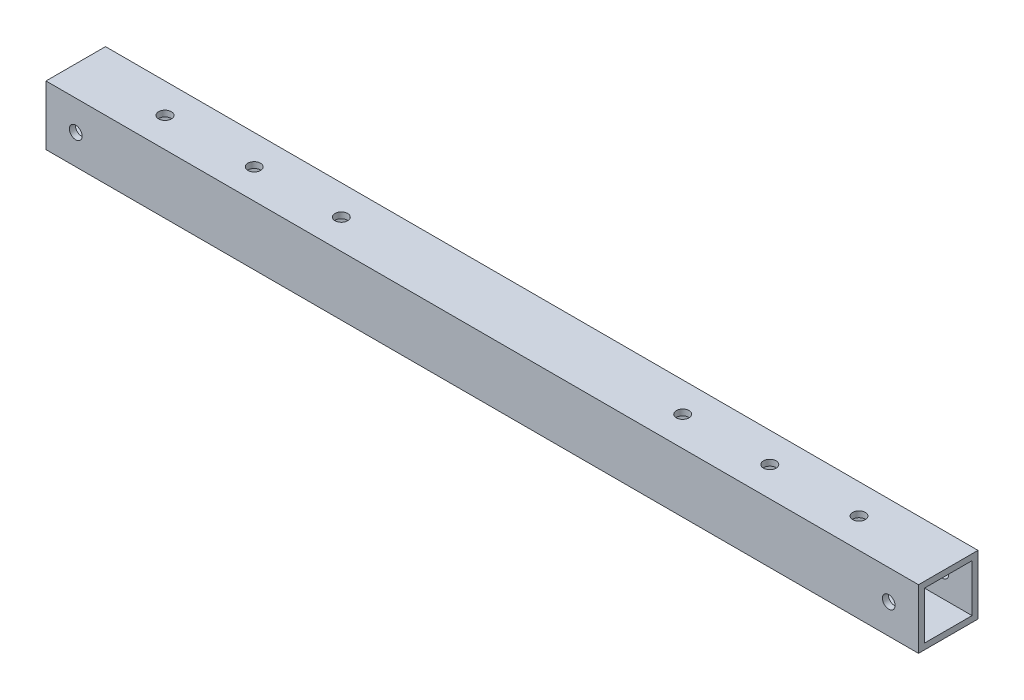
ISO-10303-21;
HEADER;
FILE_DESCRIPTION(('STEP AP214'),'2;1');
FILE_NAME('part.step','',(''),(''),'','','');
FILE_SCHEMA(('AUTOMOTIVE_DESIGN { 1 0 10303 214 1 1 1 1 }'));
ENDSEC;
DATA;
#1=APPLICATION_CONTEXT('core data for automotive mechanical design processes');
#2=APPLICATION_PROTOCOL_DEFINITION('international standard','automotive_design',2000,#1);
#3=PRODUCT_CONTEXT('',#1,'mechanical');
#4=PRODUCT('Part','Part','',(#3));
#5=PRODUCT_RELATED_PRODUCT_CATEGORY('part','',(#4));
#6=PRODUCT_DEFINITION_FORMATION('','',#4);
#7=PRODUCT_DEFINITION_CONTEXT('part definition',#1,'design');
#8=PRODUCT_DEFINITION('design','',#6,#7);
#9=PRODUCT_DEFINITION_SHAPE('','',#8);
#10=(LENGTH_UNIT() NAMED_UNIT(*) SI_UNIT(.MILLI.,.METRE.));
#11=(NAMED_UNIT(*) PLANE_ANGLE_UNIT() SI_UNIT($,.RADIAN.));
#12=(NAMED_UNIT(*) SI_UNIT($,.STERADIAN.) SOLID_ANGLE_UNIT());
#13=UNCERTAINTY_MEASURE_WITH_UNIT(LENGTH_MEASURE(1.E-05),#10,'distance_accuracy_value','');
#14=(GEOMETRIC_REPRESENTATION_CONTEXT(3) GLOBAL_UNCERTAINTY_ASSIGNED_CONTEXT((#13)) GLOBAL_UNIT_ASSIGNED_CONTEXT((#10,
#11,#12)) REPRESENTATION_CONTEXT('',''));
#15=CARTESIAN_POINT('',(0.,0.,0.));
#16=DIRECTION('',(0.,0.,1.));
#17=DIRECTION('',(1.,0.,0.));
#18=AXIS2_PLACEMENT_3D('',#15,#16,#17);
#19=CARTESIAN_POINT('',(220.,0.,0.));
#20=DIRECTION('',(1.,0.,0.));
#21=DIRECTION('',(0.,0.,-1.));
#22=AXIS2_PLACEMENT_3D('',#19,#20,#21);
#23=PLANE('',#22);
#24=DIRECTION('',(0.,1.,0.));
#25=VECTOR('',#24,1.);
#26=CARTESIAN_POINT('',(220.,7.5,-7.5));
#27=LINE('',#26,#25);
#28=CARTESIAN_POINT('',(220.,-7.5,-7.5));
#29=VERTEX_POINT('',#28);
#30=CARTESIAN_POINT('',(220.,7.5,-7.5));
#31=VERTEX_POINT('',#30);
#32=EDGE_CURVE('E142',#29,#31,#27,.T.);
#33=ORIENTED_EDGE('',*,*,#32,.T.);
#34=DIRECTION('',(0.,0.,1.));
#35=VECTOR('',#34,1.);
#36=CARTESIAN_POINT('',(220.,7.5,7.5));
#37=LINE('',#36,#35);
#38=CARTESIAN_POINT('',(220.,7.5,7.5));
#39=VERTEX_POINT('',#38);
#40=EDGE_CURVE('E145',#31,#39,#37,.T.);
#41=ORIENTED_EDGE('',*,*,#40,.T.);
#42=DIRECTION('',(0.,-1.,0.));
#43=VECTOR('',#42,1.);
#44=CARTESIAN_POINT('',(220.,7.5,7.5));
#45=LINE('',#44,#43);
#46=CARTESIAN_POINT('',(220.,-7.5,7.5));
#47=VERTEX_POINT('',#46);
#48=EDGE_CURVE('E148',#39,#47,#45,.T.);
#49=ORIENTED_EDGE('',*,*,#48,.T.);
#50=DIRECTION('',(0.,0.,-1.));
#51=VECTOR('',#50,1.);
#52=CARTESIAN_POINT('',(220.,-7.5,7.5));
#53=LINE('',#52,#51);
#54=EDGE_CURVE('E150',#47,#29,#53,.T.);
#55=ORIENTED_EDGE('',*,*,#54,.T.);
#56=EDGE_LOOP('',(#33,#41,#49,#55));
#57=FACE_BOUND('',#56,.T.);
#58=DIRECTION('',(0.,-1.,0.));
#59=VECTOR('',#58,1.);
#60=CARTESIAN_POINT('',(220.,6.,6.));
#61=LINE('',#60,#59);
#62=CARTESIAN_POINT('',(220.,6.,6.));
#63=VERTEX_POINT('',#62);
#64=CARTESIAN_POINT('',(220.,-6.,6.));
#65=VERTEX_POINT('',#64);
#66=EDGE_CURVE('E112',#63,#65,#61,.T.);
#67=ORIENTED_EDGE('',*,*,#66,.F.);
#68=DIRECTION('',(0.,0.,1.));
#69=VECTOR('',#68,1.);
#70=CARTESIAN_POINT('',(220.,6.,6.));
#71=LINE('',#70,#69);
#72=CARTESIAN_POINT('',(220.,6.,-6.));
#73=VERTEX_POINT('',#72);
#74=EDGE_CURVE('E104',#73,#63,#71,.T.);
#75=ORIENTED_EDGE('',*,*,#74,.F.);
#76=DIRECTION('',(0.,1.,0.));
#77=VECTOR('',#76,1.);
#78=CARTESIAN_POINT('',(220.,6.,-6.));
#79=LINE('',#78,#77);
#80=CARTESIAN_POINT('',(220.,-6.,-6.));
#81=VERTEX_POINT('',#80);
#82=EDGE_CURVE('E126',#81,#73,#79,.T.);
#83=ORIENTED_EDGE('',*,*,#82,.F.);
#84=DIRECTION('',(0.,0.,-1.));
#85=VECTOR('',#84,1.);
#86=CARTESIAN_POINT('',(220.,-6.,6.));
#87=LINE('',#86,#85);
#88=EDGE_CURVE('E124',#65,#81,#87,.T.);
#89=ORIENTED_EDGE('',*,*,#88,.F.);
#90=EDGE_LOOP('',(#67,#75,#83,#89));
#91=FACE_BOUND('',#90,.T.);
#92=ADVANCED_FACE('F37',(#57,#91),#23,.T.);
#93=CARTESIAN_POINT('',(0.,0.,0.));
#94=DIRECTION('',(1.,0.,0.));
#95=DIRECTION('',(0.,0.,-1.));
#96=AXIS2_PLACEMENT_3D('',#93,#94,#95);
#97=PLANE('',#96);
#98=DIRECTION('',(0.,1.,0.));
#99=VECTOR('',#98,1.);
#100=CARTESIAN_POINT('',(0.,7.5,-7.5));
#101=LINE('',#100,#99);
#102=CARTESIAN_POINT('',(0.,-7.5,-7.5));
#103=VERTEX_POINT('',#102);
#104=CARTESIAN_POINT('',(0.,7.5,-7.5));
#105=VERTEX_POINT('',#104);
#106=EDGE_CURVE('E120',#103,#105,#101,.T.);
#107=ORIENTED_EDGE('',*,*,#106,.F.);
#108=DIRECTION('',(0.,0.,-1.));
#109=VECTOR('',#108,1.);
#110=CARTESIAN_POINT('',(0.,-7.5,7.5));
#111=LINE('',#110,#109);
#112=CARTESIAN_POINT('',(0.,-7.5,7.5));
#113=VERTEX_POINT('',#112);
#114=EDGE_CURVE('E146',#113,#103,#111,.T.);
#115=ORIENTED_EDGE('',*,*,#114,.F.);
#116=DIRECTION('',(0.,-1.,0.));
#117=VECTOR('',#116,1.);
#118=CARTESIAN_POINT('',(0.,7.5,7.5));
#119=LINE('',#118,#117);
#120=CARTESIAN_POINT('',(0.,7.5,7.5));
#121=VERTEX_POINT('',#120);
#122=EDGE_CURVE('E157',#121,#113,#119,.T.);
#123=ORIENTED_EDGE('',*,*,#122,.F.);
#124=DIRECTION('',(0.,0.,1.));
#125=VECTOR('',#124,1.);
#126=CARTESIAN_POINT('',(0.,7.5,7.5));
#127=LINE('',#126,#125);
#128=EDGE_CURVE('E155',#105,#121,#127,.T.);
#129=ORIENTED_EDGE('',*,*,#128,.F.);
#130=EDGE_LOOP('',(#107,#115,#123,#129));
#131=FACE_BOUND('',#130,.T.);
#132=DIRECTION('',(0.,0.,1.));
#133=VECTOR('',#132,1.);
#134=CARTESIAN_POINT('',(0.,6.,6.));
#135=LINE('',#134,#133);
#136=CARTESIAN_POINT('',(0.,6.,-6.));
#137=VERTEX_POINT('',#136);
#138=CARTESIAN_POINT('',(0.,6.,6.));
#139=VERTEX_POINT('',#138);
#140=EDGE_CURVE('E62',#137,#139,#135,.T.);
#141=ORIENTED_EDGE('',*,*,#140,.T.);
#142=DIRECTION('',(0.,-1.,0.));
#143=VECTOR('',#142,1.);
#144=CARTESIAN_POINT('',(0.,6.,6.));
#145=LINE('',#144,#143);
#146=CARTESIAN_POINT('',(0.,-6.,6.));
#147=VERTEX_POINT('',#146);
#148=EDGE_CURVE('E119',#139,#147,#145,.T.);
#149=ORIENTED_EDGE('',*,*,#148,.T.);
#150=DIRECTION('',(0.,0.,-1.));
#151=VECTOR('',#150,1.);
#152=CARTESIAN_POINT('',(0.,-6.,6.));
#153=LINE('',#152,#151);
#154=CARTESIAN_POINT('',(0.,-6.,-6.));
#155=VERTEX_POINT('',#154);
#156=EDGE_CURVE('E134',#147,#155,#153,.T.);
#157=ORIENTED_EDGE('',*,*,#156,.T.);
#158=DIRECTION('',(0.,1.,0.));
#159=VECTOR('',#158,1.);
#160=CARTESIAN_POINT('',(0.,6.,-6.));
#161=LINE('',#160,#159);
#162=EDGE_CURVE('E113',#155,#137,#161,.T.);
#163=ORIENTED_EDGE('',*,*,#162,.T.);
#164=EDGE_LOOP('',(#141,#149,#157,#163));
#165=FACE_BOUND('',#164,.T.);
#166=ADVANCED_FACE('F302',(#131,#165),#97,.F.);
#167=CARTESIAN_POINT('',(220.,7.5,-7.5));
#168=DIRECTION('',(0.,0.,1.));
#169=DIRECTION('',(1.,0.,0.));
#170=AXIS2_PLACEMENT_3D('',#167,#168,#169);
#171=PLANE('',#170);
#172=CARTESIAN_POINT('',(7.5,0.,-7.5));
#173=DIRECTION('',(0.,0.,1.));
#174=DIRECTION('',(1.,0.,0.));
#175=AXIS2_PLACEMENT_3D('',#172,#173,#174);
#176=CIRCLE('',#175,1.6);
#177=CARTESIAN_POINT('',(9.1,0.,-7.5));
#178=VERTEX_POINT('',#177);
#179=EDGE_CURVE('E193',#178,#178,#176,.T.);
#180=ORIENTED_EDGE('',*,*,#179,.T.);
#181=EDGE_LOOP('',(#180));
#182=FACE_BOUND('',#181,.T.);
#183=CARTESIAN_POINT('',(212.5,0.,-7.5));
#184=DIRECTION('',(0.,0.,1.));
#185=DIRECTION('',(1.,0.,0.));
#186=AXIS2_PLACEMENT_3D('',#183,#184,#185);
#187=CIRCLE('',#186,1.59999999999999);
#188=CARTESIAN_POINT('',(214.1,0.,-7.5));
#189=VERTEX_POINT('',#188);
#190=EDGE_CURVE('E204',#189,#189,#187,.T.);
#191=ORIENTED_EDGE('',*,*,#190,.T.);
#192=EDGE_LOOP('',(#191));
#193=FACE_BOUND('',#192,.T.);
#194=ORIENTED_EDGE('',*,*,#106,.T.);
#195=DIRECTION('',(-1.,0.,0.));
#196=VECTOR('',#195,1.);
#197=CARTESIAN_POINT('',(220.,7.5,-7.5));
#198=LINE('',#197,#196);
#199=EDGE_CURVE('E11',#31,#105,#198,.T.);
#200=ORIENTED_EDGE('',*,*,#199,.F.);
#201=ORIENTED_EDGE('',*,*,#32,.F.);
#202=DIRECTION('',(-1.,0.,0.));
#203=VECTOR('',#202,1.);
#204=CARTESIAN_POINT('',(220.,-7.5,-7.5));
#205=LINE('',#204,#203);
#206=EDGE_CURVE('E152',#29,#103,#205,.T.);
#207=ORIENTED_EDGE('',*,*,#206,.T.);
#208=EDGE_LOOP('',(#194,#200,#201,#207));
#209=FACE_BOUND('',#208,.T.);
#210=ADVANCED_FACE('F39',(#182,#193,#209),#171,.F.);
#211=CARTESIAN_POINT('',(220.,7.5,7.5));
#212=DIRECTION('',(0.,-1.,0.));
#213=DIRECTION('',(0.,0.,-1.));
#214=AXIS2_PLACEMENT_3D('',#211,#212,#213);
#215=PLANE('',#214);
#216=CARTESIAN_POINT('',(197.5,7.5,0.));
#217=DIRECTION('',(0.,1.,0.));
#218=DIRECTION('',(0.,0.,1.));
#219=AXIS2_PLACEMENT_3D('',#216,#217,#218);
#220=CIRCLE('',#219,1.59999999999999);
#221=CARTESIAN_POINT('',(197.5,7.5,1.59999999999999));
#222=VERTEX_POINT('',#221);
#223=EDGE_CURVE('E215',#222,#222,#220,.T.);
#224=ORIENTED_EDGE('',*,*,#223,.F.);
#225=EDGE_LOOP('',(#224));
#226=FACE_BOUND('',#225,.T.);
#227=CARTESIAN_POINT('',(45.,7.5,0.));
#228=DIRECTION('',(0.,1.,0.));
#229=DIRECTION('',(0.,0.,1.));
#230=AXIS2_PLACEMENT_3D('',#227,#228,#229);
#231=CIRCLE('',#230,1.6);
#232=CARTESIAN_POINT('',(45.,7.5,1.60000000000001));
#233=VERTEX_POINT('',#232);
#234=EDGE_CURVE('E234',#233,#233,#231,.T.);
#235=ORIENTED_EDGE('',*,*,#234,.F.);
#236=EDGE_LOOP('',(#235));
#237=FACE_BOUND('',#236,.T.);
#238=CARTESIAN_POINT('',(175.,7.5,0.));
#239=DIRECTION('',(0.,1.,0.));
#240=DIRECTION('',(0.,0.,-1.));
#241=AXIS2_PLACEMENT_3D('',#238,#239,#240);
#242=CIRCLE('',#241,1.59999999999999);
#243=CARTESIAN_POINT('',(175.,7.5,-1.6));
#244=VERTEX_POINT('',#243);
#245=EDGE_CURVE('E219',#244,#244,#242,.T.);
#246=ORIENTED_EDGE('',*,*,#245,.F.);
#247=EDGE_LOOP('',(#246));
#248=FACE_BOUND('',#247,.T.);
#249=CARTESIAN_POINT('',(153.038475772934,7.5,0.));
#250=DIRECTION('',(0.,1.,0.));
#251=DIRECTION('',(0.,0.,-1.));
#252=AXIS2_PLACEMENT_3D('',#249,#250,#251);
#253=CIRCLE('',#252,1.60000000000002);
#254=CARTESIAN_POINT('',(153.038475772934,7.5,-1.60000000000002));
#255=VERTEX_POINT('',#254);
#256=EDGE_CURVE('E220',#255,#255,#253,.T.);
#257=ORIENTED_EDGE('',*,*,#256,.F.);
#258=EDGE_LOOP('',(#257));
#259=FACE_BOUND('',#258,.T.);
#260=CARTESIAN_POINT('',(22.5,7.5,0.));
#261=DIRECTION('',(0.,1.,0.));
#262=DIRECTION('',(0.,0.,1.));
#263=AXIS2_PLACEMENT_3D('',#260,#261,#262);
#264=CIRCLE('',#263,1.6);
#265=CARTESIAN_POINT('',(22.5,7.5,1.6));
#266=VERTEX_POINT('',#265);
#267=EDGE_CURVE('E226',#266,#266,#264,.T.);
#268=ORIENTED_EDGE('',*,*,#267,.F.);
#269=EDGE_LOOP('',(#268));
#270=FACE_BOUND('',#269,.T.);
#271=CARTESIAN_POINT('',(66.9615242270663,7.5,0.));
#272=DIRECTION('',(0.,1.,0.));
#273=DIRECTION('',(0.,0.,1.));
#274=AXIS2_PLACEMENT_3D('',#271,#272,#273);
#275=CIRCLE('',#274,1.60000000000001);
#276=CARTESIAN_POINT('',(66.9615242270663,7.5,1.60000000000001));
#277=VERTEX_POINT('',#276);
#278=EDGE_CURVE('E233',#277,#277,#275,.T.);
#279=ORIENTED_EDGE('',*,*,#278,.F.);
#280=EDGE_LOOP('',(#279));
#281=FACE_BOUND('',#280,.T.);
#282=ORIENTED_EDGE('',*,*,#128,.T.);
#283=DIRECTION('',(-1.,0.,0.));
#284=VECTOR('',#283,1.);
#285=CARTESIAN_POINT('',(220.,7.5,7.5));
#286=LINE('',#285,#284);
#287=EDGE_CURVE('E46',#39,#121,#286,.T.);
#288=ORIENTED_EDGE('',*,*,#287,.F.);
#289=ORIENTED_EDGE('',*,*,#40,.F.);
#290=ORIENTED_EDGE('',*,*,#199,.T.);
#291=EDGE_LOOP('',(#282,#288,#289,#290));
#292=FACE_BOUND('',#291,.T.);
#293=ADVANCED_FACE('F288',(#226,#237,#248,#259,#270,#281,#292),#215,.F.);
#294=CARTESIAN_POINT('',(220.,7.5,7.5));
#295=DIRECTION('',(0.,0.,-1.));
#296=DIRECTION('',(-1.,0.,0.));
#297=AXIS2_PLACEMENT_3D('',#294,#295,#296);
#298=PLANE('',#297);
#299=CARTESIAN_POINT('',(7.5,0.,7.5));
#300=DIRECTION('',(0.,0.,1.));
#301=DIRECTION('',(1.,0.,0.));
#302=AXIS2_PLACEMENT_3D('',#299,#300,#301);
#303=CIRCLE('',#302,1.6);
#304=CARTESIAN_POINT('',(9.1,0.,7.5));
#305=VERTEX_POINT('',#304);
#306=EDGE_CURVE('E199',#305,#305,#303,.T.);
#307=ORIENTED_EDGE('',*,*,#306,.F.);
#308=EDGE_LOOP('',(#307));
#309=FACE_BOUND('',#308,.T.);
#310=CARTESIAN_POINT('',(212.5,0.,7.5));
#311=DIRECTION('',(0.,0.,1.));
#312=DIRECTION('',(1.,0.,0.));
#313=AXIS2_PLACEMENT_3D('',#310,#311,#312);
#314=CIRCLE('',#313,1.59999999999999);
#315=CARTESIAN_POINT('',(214.1,0.,7.5));
#316=VERTEX_POINT('',#315);
#317=EDGE_CURVE('E209',#316,#316,#314,.T.);
#318=ORIENTED_EDGE('',*,*,#317,.F.);
#319=EDGE_LOOP('',(#318));
#320=FACE_BOUND('',#319,.T.);
#321=ORIENTED_EDGE('',*,*,#122,.T.);
#322=DIRECTION('',(-1.,0.,0.));
#323=VECTOR('',#322,1.);
#324=CARTESIAN_POINT('',(220.,-7.5,7.5));
#325=LINE('',#324,#323);
#326=EDGE_CURVE('E162',#47,#113,#325,.T.);
#327=ORIENTED_EDGE('',*,*,#326,.F.);
#328=ORIENTED_EDGE('',*,*,#48,.F.);
#329=ORIENTED_EDGE('',*,*,#287,.T.);
#330=EDGE_LOOP('',(#321,#327,#328,#329));
#331=FACE_BOUND('',#330,.T.);
#332=ADVANCED_FACE('F291',(#309,#320,#331),#298,.F.);
#333=CARTESIAN_POINT('',(220.,-7.5,7.5));
#334=DIRECTION('',(0.,1.,0.));
#335=DIRECTION('',(0.,0.,1.));
#336=AXIS2_PLACEMENT_3D('',#333,#334,#335);
#337=PLANE('',#336);
#338=CARTESIAN_POINT('',(197.5,-7.5,0.));
#339=DIRECTION('',(0.,1.,0.));
#340=DIRECTION('',(0.,0.,1.));
#341=AXIS2_PLACEMENT_3D('',#338,#339,#340);
#342=CIRCLE('',#341,1.59999999999999);
#343=CARTESIAN_POINT('',(197.5,-7.5,1.59999999999999));
#344=VERTEX_POINT('',#343);
#345=EDGE_CURVE('E229',#344,#344,#342,.T.);
#346=ORIENTED_EDGE('',*,*,#345,.T.);
#347=EDGE_LOOP('',(#346));
#348=FACE_BOUND('',#347,.T.);
#349=CARTESIAN_POINT('',(45.,-7.5,0.));
#350=DIRECTION('',(0.,1.,0.));
#351=DIRECTION('',(0.,0.,1.));
#352=AXIS2_PLACEMENT_3D('',#349,#350,#351);
#353=CIRCLE('',#352,1.6);
#354=CARTESIAN_POINT('',(45.,-7.5,1.60000000000001));
#355=VERTEX_POINT('',#354);
#356=EDGE_CURVE('E230',#355,#355,#353,.T.);
#357=ORIENTED_EDGE('',*,*,#356,.T.);
#358=EDGE_LOOP('',(#357));
#359=FACE_BOUND('',#358,.T.);
#360=CARTESIAN_POINT('',(175.,-7.5,0.));
#361=DIRECTION('',(0.,1.,0.));
#362=DIRECTION('',(0.,0.,-1.));
#363=AXIS2_PLACEMENT_3D('',#360,#361,#362);
#364=CIRCLE('',#363,1.59999999999999);
#365=CARTESIAN_POINT('',(175.,-7.5,-1.6));
#366=VERTEX_POINT('',#365);
#367=EDGE_CURVE('E237',#366,#366,#364,.T.);
#368=ORIENTED_EDGE('',*,*,#367,.T.);
#369=EDGE_LOOP('',(#368));
#370=FACE_BOUND('',#369,.T.);
#371=CARTESIAN_POINT('',(153.038475772934,-7.5,0.));
#372=DIRECTION('',(0.,1.,0.));
#373=DIRECTION('',(0.,0.,-1.));
#374=AXIS2_PLACEMENT_3D('',#371,#372,#373);
#375=CIRCLE('',#374,1.60000000000002);
#376=CARTESIAN_POINT('',(153.038475772934,-7.5,-1.60000000000002));
#377=VERTEX_POINT('',#376);
#378=EDGE_CURVE('E216',#377,#377,#375,.T.);
#379=ORIENTED_EDGE('',*,*,#378,.T.);
#380=EDGE_LOOP('',(#379));
#381=FACE_BOUND('',#380,.T.);
#382=CARTESIAN_POINT('',(22.5,-7.5,0.));
#383=DIRECTION('',(0.,1.,0.));
#384=DIRECTION('',(0.,0.,1.));
#385=AXIS2_PLACEMENT_3D('',#382,#383,#384);
#386=CIRCLE('',#385,1.6);
#387=CARTESIAN_POINT('',(22.5,-7.5,1.6));
#388=VERTEX_POINT('',#387);
#389=EDGE_CURVE('E223',#388,#388,#386,.T.);
#390=ORIENTED_EDGE('',*,*,#389,.T.);
#391=EDGE_LOOP('',(#390));
#392=FACE_BOUND('',#391,.T.);
#393=CARTESIAN_POINT('',(66.9615242270663,-7.5,0.));
#394=DIRECTION('',(0.,1.,0.));
#395=DIRECTION('',(0.,0.,1.));
#396=AXIS2_PLACEMENT_3D('',#393,#394,#395);
#397=CIRCLE('',#396,1.60000000000001);
#398=CARTESIAN_POINT('',(66.9615242270663,-7.5,1.60000000000001));
#399=VERTEX_POINT('',#398);
#400=EDGE_CURVE('E171',#399,#399,#397,.T.);
#401=ORIENTED_EDGE('',*,*,#400,.T.);
#402=EDGE_LOOP('',(#401));
#403=FACE_BOUND('',#402,.T.);
#404=ORIENTED_EDGE('',*,*,#114,.T.);
#405=ORIENTED_EDGE('',*,*,#206,.F.);
#406=ORIENTED_EDGE('',*,*,#54,.F.);
#407=ORIENTED_EDGE('',*,*,#326,.T.);
#408=EDGE_LOOP('',(#404,#405,#406,#407));
#409=FACE_BOUND('',#408,.T.);
#410=ADVANCED_FACE('F267',(#348,#359,#370,#381,#392,#403,#409),#337,.F.);
#411=CARTESIAN_POINT('',(220.,6.,6.));
#412=DIRECTION('',(0.,-1.,0.));
#413=DIRECTION('',(0.,0.,-1.));
#414=AXIS2_PLACEMENT_3D('',#411,#412,#413);
#415=PLANE('',#414);
#416=CARTESIAN_POINT('',(197.5,6.,0.));
#417=DIRECTION('',(0.,-1.,0.));
#418=DIRECTION('',(0.,0.,-1.));
#419=AXIS2_PLACEMENT_3D('',#416,#417,#418);
#420=CIRCLE('',#419,1.59999999999999);
#421=CARTESIAN_POINT('',(197.5,6.,-1.59999999999999));
#422=VERTEX_POINT('',#421);
#423=EDGE_CURVE('E132',#422,#422,#420,.T.);
#424=ORIENTED_EDGE('',*,*,#423,.F.);
#425=EDGE_LOOP('',(#424));
#426=FACE_BOUND('',#425,.T.);
#427=CARTESIAN_POINT('',(45.,6.,0.));
#428=DIRECTION('',(0.,-1.,0.));
#429=DIRECTION('',(0.,0.,-1.));
#430=AXIS2_PLACEMENT_3D('',#427,#428,#429);
#431=CIRCLE('',#430,1.6);
#432=CARTESIAN_POINT('',(45.,6.,-1.59999999999999));
#433=VERTEX_POINT('',#432);
#434=EDGE_CURVE('E187',#433,#433,#431,.T.);
#435=ORIENTED_EDGE('',*,*,#434,.F.);
#436=EDGE_LOOP('',(#435));
#437=FACE_BOUND('',#436,.T.);
#438=CARTESIAN_POINT('',(175.,6.,0.));
#439=DIRECTION('',(0.,-1.,0.));
#440=DIRECTION('',(0.,0.,-1.));
#441=AXIS2_PLACEMENT_3D('',#438,#439,#440);
#442=CIRCLE('',#441,1.59999999999999);
#443=CARTESIAN_POINT('',(175.,6.,-1.6));
#444=VERTEX_POINT('',#443);
#445=EDGE_CURVE('E183',#444,#444,#442,.T.);
#446=ORIENTED_EDGE('',*,*,#445,.F.);
#447=EDGE_LOOP('',(#446));
#448=FACE_BOUND('',#447,.T.);
#449=CARTESIAN_POINT('',(153.038475772934,6.,0.));
#450=DIRECTION('',(0.,-1.,0.));
#451=DIRECTION('',(0.,0.,-1.));
#452=AXIS2_PLACEMENT_3D('',#449,#450,#451);
#453=CIRCLE('',#452,1.60000000000002);
#454=CARTESIAN_POINT('',(153.038475772934,6.,-1.60000000000002));
#455=VERTEX_POINT('',#454);
#456=EDGE_CURVE('E179',#455,#455,#453,.T.);
#457=ORIENTED_EDGE('',*,*,#456,.F.);
#458=EDGE_LOOP('',(#457));
#459=FACE_BOUND('',#458,.T.);
#460=CARTESIAN_POINT('',(22.5,6.,0.));
#461=DIRECTION('',(0.,-1.,0.));
#462=DIRECTION('',(0.,0.,-1.));
#463=AXIS2_PLACEMENT_3D('',#460,#461,#462);
#464=CIRCLE('',#463,1.6);
#465=CARTESIAN_POINT('',(22.5,6.,-1.6));
#466=VERTEX_POINT('',#465);
#467=EDGE_CURVE('E175',#466,#466,#464,.T.);
#468=ORIENTED_EDGE('',*,*,#467,.F.);
#469=EDGE_LOOP('',(#468));
#470=FACE_BOUND('',#469,.T.);
#471=CARTESIAN_POINT('',(66.9615242270663,6.,0.));
#472=DIRECTION('',(0.,-1.,0.));
#473=DIRECTION('',(0.,0.,-1.));
#474=AXIS2_PLACEMENT_3D('',#471,#472,#473);
#475=CIRCLE('',#474,1.60000000000001);
#476=CARTESIAN_POINT('',(66.9615242270663,6.,-1.6));
#477=VERTEX_POINT('',#476);
#478=EDGE_CURVE('E170',#477,#477,#475,.T.);
#479=ORIENTED_EDGE('',*,*,#478,.F.);
#480=EDGE_LOOP('',(#479));
#481=FACE_BOUND('',#480,.T.);
#482=ORIENTED_EDGE('',*,*,#140,.F.);
#483=DIRECTION('',(-1.,0.,0.));
#484=VECTOR('',#483,1.);
#485=CARTESIAN_POINT('',(220.,6.,-6.));
#486=LINE('',#485,#484);
#487=EDGE_CURVE('E108',#73,#137,#486,.T.);
#488=ORIENTED_EDGE('',*,*,#487,.F.);
#489=ORIENTED_EDGE('',*,*,#74,.T.);
#490=DIRECTION('',(-1.,0.,0.));
#491=VECTOR('',#490,1.);
#492=CARTESIAN_POINT('',(220.,6.,6.));
#493=LINE('',#492,#491);
#494=EDGE_CURVE('E107',#63,#139,#493,.T.);
#495=ORIENTED_EDGE('',*,*,#494,.T.);
#496=EDGE_LOOP('',(#482,#488,#489,#495));
#497=FACE_BOUND('',#496,.T.);
#498=ADVANCED_FACE('F106',(#426,#437,#448,#459,#470,#481,#497),#415,.T.);
#499=CARTESIAN_POINT('',(220.,6.,6.));
#500=DIRECTION('',(0.,0.,-1.));
#501=DIRECTION('',(0.,1.,0.));
#502=AXIS2_PLACEMENT_3D('',#499,#500,#501);
#503=PLANE('',#502);
#504=CARTESIAN_POINT('',(7.5,0.,6.));
#505=DIRECTION('',(0.,0.,-1.));
#506=DIRECTION('',(0.,1.,0.));
#507=AXIS2_PLACEMENT_3D('',#504,#505,#506);
#508=CIRCLE('',#507,1.6);
#509=CARTESIAN_POINT('',(7.5,1.6,6.));
#510=VERTEX_POINT('',#509);
#511=EDGE_CURVE('E212',#510,#510,#508,.T.);
#512=ORIENTED_EDGE('',*,*,#511,.F.);
#513=EDGE_LOOP('',(#512));
#514=FACE_BOUND('',#513,.T.);
#515=CARTESIAN_POINT('',(212.5,0.,6.));
#516=DIRECTION('',(0.,0.,-1.));
#517=DIRECTION('',(0.,1.,0.));
#518=AXIS2_PLACEMENT_3D('',#515,#516,#517);
#519=CIRCLE('',#518,1.59999999999999);
#520=CARTESIAN_POINT('',(212.5,1.59999999999999,6.));
#521=VERTEX_POINT('',#520);
#522=EDGE_CURVE('E192',#521,#521,#519,.T.);
#523=ORIENTED_EDGE('',*,*,#522,.F.);
#524=EDGE_LOOP('',(#523));
#525=FACE_BOUND('',#524,.T.);
#526=ORIENTED_EDGE('',*,*,#148,.F.);
#527=ORIENTED_EDGE('',*,*,#494,.F.);
#528=ORIENTED_EDGE('',*,*,#66,.T.);
#529=DIRECTION('',(-1.,0.,0.));
#530=VECTOR('',#529,1.);
#531=CARTESIAN_POINT('',(220.,-6.,6.));
#532=LINE('',#531,#530);
#533=EDGE_CURVE('E121',#65,#147,#532,.T.);
#534=ORIENTED_EDGE('',*,*,#533,.T.);
#535=EDGE_LOOP('',(#526,#527,#528,#534));
#536=FACE_BOUND('',#535,.T.);
#537=ADVANCED_FACE('F116',(#514,#525,#536),#503,.T.);
#538=CARTESIAN_POINT('',(220.,-6.,6.));
#539=DIRECTION('',(0.,1.,0.));
#540=DIRECTION('',(0.,0.,1.));
#541=AXIS2_PLACEMENT_3D('',#538,#539,#540);
#542=PLANE('',#541);
#543=CARTESIAN_POINT('',(197.5,-6.,0.));
#544=DIRECTION('',(0.,1.,0.));
#545=DIRECTION('',(0.,0.,1.));
#546=AXIS2_PLACEMENT_3D('',#543,#544,#545);
#547=CIRCLE('',#546,1.59999999999999);
#548=CARTESIAN_POINT('',(197.5,-6.,1.59999999999999));
#549=VERTEX_POINT('',#548);
#550=EDGE_CURVE('E188',#549,#549,#547,.T.);
#551=ORIENTED_EDGE('',*,*,#550,.F.);
#552=EDGE_LOOP('',(#551));
#553=FACE_BOUND('',#552,.T.);
#554=CARTESIAN_POINT('',(45.,-6.,0.));
#555=DIRECTION('',(0.,1.,0.));
#556=DIRECTION('',(0.,0.,1.));
#557=AXIS2_PLACEMENT_3D('',#554,#555,#556);
#558=CIRCLE('',#557,1.6);
#559=CARTESIAN_POINT('',(45.,-6.,1.60000000000001));
#560=VERTEX_POINT('',#559);
#561=EDGE_CURVE('E184',#560,#560,#558,.T.);
#562=ORIENTED_EDGE('',*,*,#561,.F.);
#563=EDGE_LOOP('',(#562));
#564=FACE_BOUND('',#563,.T.);
#565=CARTESIAN_POINT('',(175.,-6.,0.));
#566=DIRECTION('',(0.,1.,0.));
#567=DIRECTION('',(0.,0.,1.));
#568=AXIS2_PLACEMENT_3D('',#565,#566,#567);
#569=CIRCLE('',#568,1.59999999999999);
#570=CARTESIAN_POINT('',(175.,-6.,1.59999999999999));
#571=VERTEX_POINT('',#570);
#572=EDGE_CURVE('E180',#571,#571,#569,.T.);
#573=ORIENTED_EDGE('',*,*,#572,.F.);
#574=EDGE_LOOP('',(#573));
#575=FACE_BOUND('',#574,.T.);
#576=CARTESIAN_POINT('',(153.038475772934,-6.,0.));
#577=DIRECTION('',(0.,1.,0.));
#578=DIRECTION('',(0.,0.,1.));
#579=AXIS2_PLACEMENT_3D('',#576,#577,#578);
#580=CIRCLE('',#579,1.60000000000002);
#581=CARTESIAN_POINT('',(153.038475772934,-6.,1.60000000000002));
#582=VERTEX_POINT('',#581);
#583=EDGE_CURVE('E176',#582,#582,#580,.T.);
#584=ORIENTED_EDGE('',*,*,#583,.F.);
#585=EDGE_LOOP('',(#584));
#586=FACE_BOUND('',#585,.T.);
#587=CARTESIAN_POINT('',(22.5,-6.,0.));
#588=DIRECTION('',(0.,1.,0.));
#589=DIRECTION('',(0.,0.,1.));
#590=AXIS2_PLACEMENT_3D('',#587,#588,#589);
#591=CIRCLE('',#590,1.6);
#592=CARTESIAN_POINT('',(22.5,-6.,1.6));
#593=VERTEX_POINT('',#592);
#594=EDGE_CURVE('E172',#593,#593,#591,.T.);
#595=ORIENTED_EDGE('',*,*,#594,.F.);
#596=EDGE_LOOP('',(#595));
#597=FACE_BOUND('',#596,.T.);
#598=CARTESIAN_POINT('',(66.9615242270663,-6.,0.));
#599=DIRECTION('',(0.,1.,0.));
#600=DIRECTION('',(0.,0.,1.));
#601=AXIS2_PLACEMENT_3D('',#598,#599,#600);
#602=CIRCLE('',#601,1.60000000000001);
#603=CARTESIAN_POINT('',(66.9615242270663,-6.,1.60000000000001));
#604=VERTEX_POINT('',#603);
#605=EDGE_CURVE('E167',#604,#604,#602,.T.);
#606=ORIENTED_EDGE('',*,*,#605,.F.);
#607=EDGE_LOOP('',(#606));
#608=FACE_BOUND('',#607,.T.);
#609=ORIENTED_EDGE('',*,*,#156,.F.);
#610=ORIENTED_EDGE('',*,*,#533,.F.);
#611=ORIENTED_EDGE('',*,*,#88,.T.);
#612=DIRECTION('',(-1.,0.,0.));
#613=VECTOR('',#612,1.);
#614=CARTESIAN_POINT('',(220.,-6.,-6.));
#615=LINE('',#614,#613);
#616=EDGE_CURVE('E54',#81,#155,#615,.T.);
#617=ORIENTED_EDGE('',*,*,#616,.T.);
#618=EDGE_LOOP('',(#609,#610,#611,#617));
#619=FACE_BOUND('',#618,.T.);
#620=ADVANCED_FACE('F385',(#553,#564,#575,#586,#597,#608,#619),#542,.T.);
#621=CARTESIAN_POINT('',(220.,6.,-6.));
#622=DIRECTION('',(0.,0.,1.));
#623=DIRECTION('',(1.,0.,0.));
#624=AXIS2_PLACEMENT_3D('',#621,#622,#623);
#625=PLANE('',#624);
#626=CARTESIAN_POINT('',(7.5,0.,-6.));
#627=DIRECTION('',(0.,0.,1.));
#628=DIRECTION('',(1.,0.,0.));
#629=AXIS2_PLACEMENT_3D('',#626,#627,#628);
#630=CIRCLE('',#629,1.6);
#631=CARTESIAN_POINT('',(9.1,0.,-6.));
#632=VERTEX_POINT('',#631);
#633=EDGE_CURVE('E41',#632,#632,#630,.T.);
#634=ORIENTED_EDGE('',*,*,#633,.F.);
#635=EDGE_LOOP('',(#634));
#636=FACE_BOUND('',#635,.T.);
#637=CARTESIAN_POINT('',(212.5,0.,-6.));
#638=DIRECTION('',(0.,0.,1.));
#639=DIRECTION('',(1.,0.,0.));
#640=AXIS2_PLACEMENT_3D('',#637,#638,#639);
#641=CIRCLE('',#640,1.59999999999999);
#642=CARTESIAN_POINT('',(214.1,0.,-6.));
#643=VERTEX_POINT('',#642);
#644=EDGE_CURVE('E190',#643,#643,#641,.T.);
#645=ORIENTED_EDGE('',*,*,#644,.F.);
#646=EDGE_LOOP('',(#645));
#647=FACE_BOUND('',#646,.T.);
#648=ORIENTED_EDGE('',*,*,#162,.F.);
#649=ORIENTED_EDGE('',*,*,#616,.F.);
#650=ORIENTED_EDGE('',*,*,#82,.T.);
#651=ORIENTED_EDGE('',*,*,#487,.T.);
#652=EDGE_LOOP('',(#648,#649,#650,#651));
#653=FACE_BOUND('',#652,.T.);
#654=ADVANCED_FACE('F390',(#636,#647,#653),#625,.T.);
#655=CARTESIAN_POINT('',(66.9615242270663,-7.5,0.));
#656=DIRECTION('',(0.,1.,0.));
#657=DIRECTION('',(0.,0.,1.));
#658=AXIS2_PLACEMENT_3D('',#655,#656,#657);
#659=CYLINDRICAL_SURFACE('',#658,1.60000000000001);
#660=ORIENTED_EDGE('',*,*,#605,.T.);
#661=EDGE_LOOP('',(#660));
#662=FACE_BOUND('',#661,.T.);
#663=ORIENTED_EDGE('',*,*,#400,.F.);
#664=EDGE_LOOP('',(#663));
#665=FACE_BOUND('',#664,.T.);
#666=ADVANCED_FACE('F285',(#662,#665),#659,.F.);
#667=CARTESIAN_POINT('',(22.5,-7.5,0.));
#668=DIRECTION('',(0.,1.,0.));
#669=DIRECTION('',(0.,0.,1.));
#670=AXIS2_PLACEMENT_3D('',#667,#668,#669);
#671=CYLINDRICAL_SURFACE('',#670,1.6);
#672=ORIENTED_EDGE('',*,*,#594,.T.);
#673=EDGE_LOOP('',(#672));
#674=FACE_BOUND('',#673,.T.);
#675=ORIENTED_EDGE('',*,*,#389,.F.);
#676=EDGE_LOOP('',(#675));
#677=FACE_BOUND('',#676,.T.);
#678=ADVANCED_FACE('F402',(#674,#677),#671,.F.);
#679=CARTESIAN_POINT('',(153.038475772934,-7.5,0.));
#680=DIRECTION('',(0.,1.,0.));
#681=DIRECTION('',(0.,0.,1.));
#682=AXIS2_PLACEMENT_3D('',#679,#680,#681);
#683=CYLINDRICAL_SURFACE('',#682,1.60000000000002);
#684=ORIENTED_EDGE('',*,*,#583,.T.);
#685=EDGE_LOOP('',(#684));
#686=FACE_BOUND('',#685,.T.);
#687=ORIENTED_EDGE('',*,*,#378,.F.);
#688=EDGE_LOOP('',(#687));
#689=FACE_BOUND('',#688,.T.);
#690=ADVANCED_FACE('F411',(#686,#689),#683,.F.);
#691=CARTESIAN_POINT('',(175.,-7.5,0.));
#692=DIRECTION('',(0.,1.,0.));
#693=DIRECTION('',(0.,0.,1.));
#694=AXIS2_PLACEMENT_3D('',#691,#692,#693);
#695=CYLINDRICAL_SURFACE('',#694,1.59999999999999);
#696=ORIENTED_EDGE('',*,*,#572,.T.);
#697=EDGE_LOOP('',(#696));
#698=FACE_BOUND('',#697,.T.);
#699=ORIENTED_EDGE('',*,*,#367,.F.);
#700=EDGE_LOOP('',(#699));
#701=FACE_BOUND('',#700,.T.);
#702=ADVANCED_FACE('F421',(#698,#701),#695,.F.);
#703=CARTESIAN_POINT('',(45.,-7.5,0.));
#704=DIRECTION('',(0.,1.,0.));
#705=DIRECTION('',(0.,0.,1.));
#706=AXIS2_PLACEMENT_3D('',#703,#704,#705);
#707=CYLINDRICAL_SURFACE('',#706,1.6);
#708=ORIENTED_EDGE('',*,*,#561,.T.);
#709=EDGE_LOOP('',(#708));
#710=FACE_BOUND('',#709,.T.);
#711=ORIENTED_EDGE('',*,*,#356,.F.);
#712=EDGE_LOOP('',(#711));
#713=FACE_BOUND('',#712,.T.);
#714=ADVANCED_FACE('F431',(#710,#713),#707,.F.);
#715=CARTESIAN_POINT('',(197.5,-7.5,0.));
#716=DIRECTION('',(0.,1.,0.));
#717=DIRECTION('',(0.,0.,1.));
#718=AXIS2_PLACEMENT_3D('',#715,#716,#717);
#719=CYLINDRICAL_SURFACE('',#718,1.59999999999999);
#720=ORIENTED_EDGE('',*,*,#550,.T.);
#721=EDGE_LOOP('',(#720));
#722=FACE_BOUND('',#721,.T.);
#723=ORIENTED_EDGE('',*,*,#345,.F.);
#724=EDGE_LOOP('',(#723));
#725=FACE_BOUND('',#724,.T.);
#726=ADVANCED_FACE('F283',(#722,#725),#719,.F.);
#727=ORIENTED_EDGE('',*,*,#478,.T.);
#728=EDGE_LOOP('',(#727));
#729=FACE_BOUND('',#728,.T.);
#730=ORIENTED_EDGE('',*,*,#278,.T.);
#731=EDGE_LOOP('',(#730));
#732=FACE_BOUND('',#731,.T.);
#733=ADVANCED_FACE('F279',(#729,#732),#659,.F.);
#734=ORIENTED_EDGE('',*,*,#467,.T.);
#735=EDGE_LOOP('',(#734));
#736=FACE_BOUND('',#735,.T.);
#737=ORIENTED_EDGE('',*,*,#267,.T.);
#738=EDGE_LOOP('',(#737));
#739=FACE_BOUND('',#738,.T.);
#740=ADVANCED_FACE('F282',(#736,#739),#671,.F.);
#741=ORIENTED_EDGE('',*,*,#456,.T.);
#742=EDGE_LOOP('',(#741));
#743=FACE_BOUND('',#742,.T.);
#744=ORIENTED_EDGE('',*,*,#256,.T.);
#745=EDGE_LOOP('',(#744));
#746=FACE_BOUND('',#745,.T.);
#747=ADVANCED_FACE('F423',(#743,#746),#683,.F.);
#748=ORIENTED_EDGE('',*,*,#445,.T.);
#749=EDGE_LOOP('',(#748));
#750=FACE_BOUND('',#749,.T.);
#751=ORIENTED_EDGE('',*,*,#245,.T.);
#752=EDGE_LOOP('',(#751));
#753=FACE_BOUND('',#752,.T.);
#754=ADVANCED_FACE('F434',(#750,#753),#695,.F.);
#755=ORIENTED_EDGE('',*,*,#434,.T.);
#756=EDGE_LOOP('',(#755));
#757=FACE_BOUND('',#756,.T.);
#758=ORIENTED_EDGE('',*,*,#234,.T.);
#759=EDGE_LOOP('',(#758));
#760=FACE_BOUND('',#759,.T.);
#761=ADVANCED_FACE('F348',(#757,#760),#707,.F.);
#762=ORIENTED_EDGE('',*,*,#423,.T.);
#763=EDGE_LOOP('',(#762));
#764=FACE_BOUND('',#763,.T.);
#765=ORIENTED_EDGE('',*,*,#223,.T.);
#766=EDGE_LOOP('',(#765));
#767=FACE_BOUND('',#766,.T.);
#768=ADVANCED_FACE('F262',(#764,#767),#719,.F.);
#769=CARTESIAN_POINT('',(212.5,0.,-7.5));
#770=DIRECTION('',(0.,0.,1.));
#771=DIRECTION('',(1.,0.,0.));
#772=AXIS2_PLACEMENT_3D('',#769,#770,#771);
#773=CYLINDRICAL_SURFACE('',#772,1.59999999999999);
#774=ORIENTED_EDGE('',*,*,#644,.T.);
#775=EDGE_LOOP('',(#774));
#776=FACE_BOUND('',#775,.T.);
#777=ORIENTED_EDGE('',*,*,#190,.F.);
#778=EDGE_LOOP('',(#777));
#779=FACE_BOUND('',#778,.T.);
#780=ADVANCED_FACE('F335',(#776,#779),#773,.F.);
#781=CARTESIAN_POINT('',(7.5,0.,-7.5));
#782=DIRECTION('',(0.,0.,1.));
#783=DIRECTION('',(1.,0.,0.));
#784=AXIS2_PLACEMENT_3D('',#781,#782,#783);
#785=CYLINDRICAL_SURFACE('',#784,1.6);
#786=ORIENTED_EDGE('',*,*,#633,.T.);
#787=EDGE_LOOP('',(#786));
#788=FACE_BOUND('',#787,.T.);
#789=ORIENTED_EDGE('',*,*,#179,.F.);
#790=EDGE_LOOP('',(#789));
#791=FACE_BOUND('',#790,.T.);
#792=ADVANCED_FACE('F332',(#788,#791),#785,.F.);
#793=ORIENTED_EDGE('',*,*,#522,.T.);
#794=EDGE_LOOP('',(#793));
#795=FACE_BOUND('',#794,.T.);
#796=ORIENTED_EDGE('',*,*,#317,.T.);
#797=EDGE_LOOP('',(#796));
#798=FACE_BOUND('',#797,.T.);
#799=ADVANCED_FACE('F329',(#795,#798),#773,.F.);
#800=ORIENTED_EDGE('',*,*,#511,.T.);
#801=EDGE_LOOP('',(#800));
#802=FACE_BOUND('',#801,.T.);
#803=ORIENTED_EDGE('',*,*,#306,.T.);
#804=EDGE_LOOP('',(#803));
#805=FACE_BOUND('',#804,.T.);
#806=ADVANCED_FACE('F331',(#802,#805),#785,.F.);
#807=CLOSED_SHELL('',(#92,#166,#210,#293,#332,#410,#498,#537,#620,#654,#666,#678,#690,#702,#714,
#726,#733,#740,#747,#754,#761,#768,#780,#792,#799,#806));
#808=MANIFOLD_SOLID_BREP('B2',#807);
#809=ADVANCED_BREP_SHAPE_REPRESENTATION('',(#18,#808),#14);
#810=SHAPE_DEFINITION_REPRESENTATION(#9,#809);
ENDSEC;
END-ISO-10303-21;
